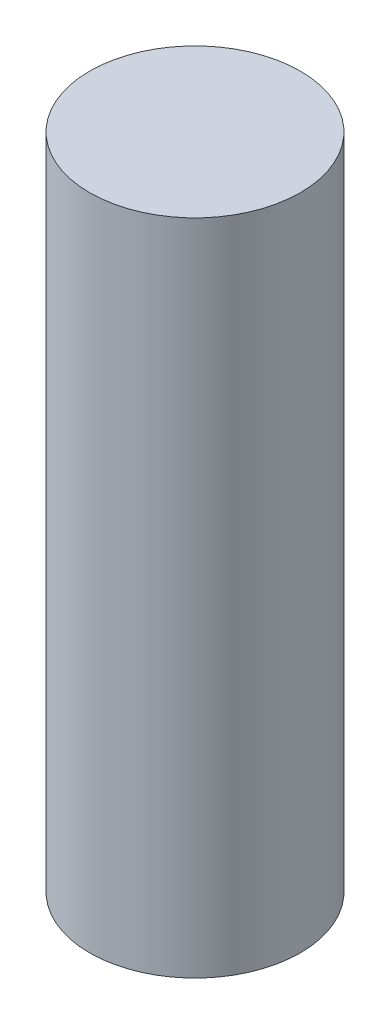
ISO-10303-21;
HEADER;
FILE_DESCRIPTION(('STEP AP214'),'2;1');
FILE_NAME('part.step','',(''),(''),'','','');
FILE_SCHEMA(('AUTOMOTIVE_DESIGN { 1 0 10303 214 1 1 1 1 }'));
ENDSEC;
DATA;
#1=APPLICATION_CONTEXT('core data for automotive mechanical design processes');
#2=APPLICATION_PROTOCOL_DEFINITION('international standard','automotive_design',2000,#1);
#3=PRODUCT_CONTEXT('',#1,'mechanical');
#4=PRODUCT('Part','Part','',(#3));
#5=PRODUCT_RELATED_PRODUCT_CATEGORY('part','',(#4));
#6=PRODUCT_DEFINITION_FORMATION('','',#4);
#7=PRODUCT_DEFINITION_CONTEXT('part definition',#1,'design');
#8=PRODUCT_DEFINITION('design','',#6,#7);
#9=PRODUCT_DEFINITION_SHAPE('','',#8);
#10=(LENGTH_UNIT() NAMED_UNIT(*) SI_UNIT(.MILLI.,.METRE.));
#11=(NAMED_UNIT(*) PLANE_ANGLE_UNIT() SI_UNIT($,.RADIAN.));
#12=(NAMED_UNIT(*) SI_UNIT($,.STERADIAN.) SOLID_ANGLE_UNIT());
#13=UNCERTAINTY_MEASURE_WITH_UNIT(LENGTH_MEASURE(1.E-05),#10,'distance_accuracy_value','');
#14=(GEOMETRIC_REPRESENTATION_CONTEXT(3) GLOBAL_UNCERTAINTY_ASSIGNED_CONTEXT((#13)) GLOBAL_UNIT_ASSIGNED_CONTEXT((#10,
#11,#12)) REPRESENTATION_CONTEXT('',''));
#15=CARTESIAN_POINT('',(0.,0.,0.));
#16=DIRECTION('',(0.,0.,1.));
#17=DIRECTION('',(1.,0.,0.));
#18=AXIS2_PLACEMENT_3D('',#15,#16,#17);
#19=CARTESIAN_POINT('',(0.,15.,0.));
#20=DIRECTION('',(0.,-1.,0.));
#21=DIRECTION('',(0.,0.,-1.));
#22=AXIS2_PLACEMENT_3D('',#19,#20,#21);
#23=CYLINDRICAL_SURFACE('',#22,2.4);
#24=CARTESIAN_POINT('',(0.,15.,0.));
#25=DIRECTION('',(0.,1.,0.));
#26=DIRECTION('',(0.,0.,1.));
#27=AXIS2_PLACEMENT_3D('',#24,#25,#26);
#28=CIRCLE('',#27,2.4);
#29=CARTESIAN_POINT('',(0.,15.,2.4));
#30=VERTEX_POINT('',#29);
#31=EDGE_CURVE('E10',#30,#30,#28,.T.);
#32=ORIENTED_EDGE('',*,*,#31,.F.);
#33=EDGE_LOOP('',(#32));
#34=FACE_BOUND('',#33,.T.);
#35=CARTESIAN_POINT('',(0.,0.,0.));
#36=DIRECTION('',(0.,1.,0.));
#37=DIRECTION('',(0.,0.,1.));
#38=AXIS2_PLACEMENT_3D('',#35,#36,#37);
#39=CIRCLE('',#38,2.4);
#40=CARTESIAN_POINT('',(0.,0.,2.4));
#41=VERTEX_POINT('',#40);
#42=EDGE_CURVE('E33',#41,#41,#39,.T.);
#43=ORIENTED_EDGE('',*,*,#42,.T.);
#44=EDGE_LOOP('',(#43));
#45=FACE_BOUND('',#44,.T.);
#46=ADVANCED_FACE('F30',(#34,#45),#23,.T.);
#47=CARTESIAN_POINT('',(0.,15.,0.));
#48=DIRECTION('',(0.,1.,0.));
#49=DIRECTION('',(0.,0.,1.));
#50=AXIS2_PLACEMENT_3D('',#47,#48,#49);
#51=PLANE('',#50);
#52=ORIENTED_EDGE('',*,*,#31,.T.);
#53=EDGE_LOOP('',(#52));
#54=FACE_BOUND('',#53,.T.);
#55=ADVANCED_FACE('F45',(#54),#51,.T.);
#56=CARTESIAN_POINT('',(0.,0.,0.));
#57=DIRECTION('',(0.,1.,0.));
#58=DIRECTION('',(0.,0.,1.));
#59=AXIS2_PLACEMENT_3D('',#56,#57,#58);
#60=PLANE('',#59);
#61=ORIENTED_EDGE('',*,*,#42,.F.);
#62=EDGE_LOOP('',(#61));
#63=FACE_BOUND('',#62,.T.);
#64=ADVANCED_FACE('F43',(#63),#60,.F.);
#65=CLOSED_SHELL('',(#46,#55,#64));
#66=MANIFOLD_SOLID_BREP('B2',#65);
#67=ADVANCED_BREP_SHAPE_REPRESENTATION('',(#18,#66),#14);
#68=SHAPE_DEFINITION_REPRESENTATION(#9,#67);
ENDSEC;
END-ISO-10303-21;
